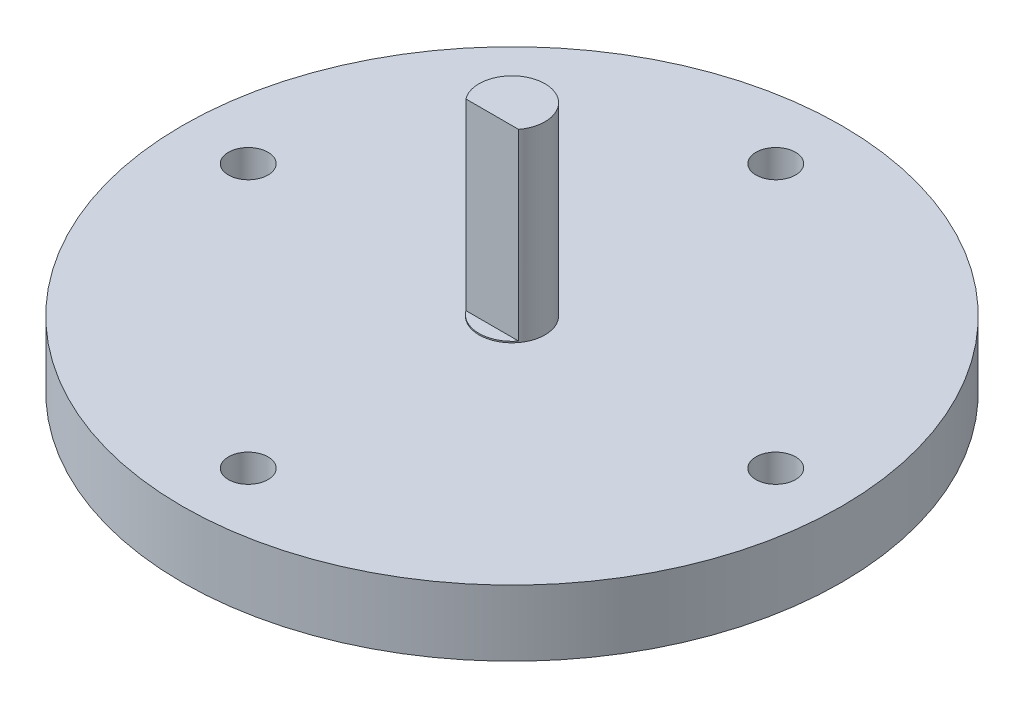
ISO-10303-21;
HEADER;
FILE_DESCRIPTION(('STEP AP214'),'2;1');
FILE_NAME('part.step','',(''),(''),'','','');
FILE_SCHEMA(('AUTOMOTIVE_DESIGN { 1 0 10303 214 1 1 1 1 }'));
ENDSEC;
DATA;
#1=APPLICATION_CONTEXT('core data for automotive mechanical design processes');
#2=APPLICATION_PROTOCOL_DEFINITION('international standard','automotive_design',2000,#1);
#3=PRODUCT_CONTEXT('',#1,'mechanical');
#4=PRODUCT('Part','Part','',(#3));
#5=PRODUCT_RELATED_PRODUCT_CATEGORY('part','',(#4));
#6=PRODUCT_DEFINITION_FORMATION('','',#4);
#7=PRODUCT_DEFINITION_CONTEXT('part definition',#1,'design');
#8=PRODUCT_DEFINITION('design','',#6,#7);
#9=PRODUCT_DEFINITION_SHAPE('','',#8);
#10=(LENGTH_UNIT() NAMED_UNIT(*) SI_UNIT(.MILLI.,.METRE.));
#11=(NAMED_UNIT(*) PLANE_ANGLE_UNIT() SI_UNIT($,.RADIAN.));
#12=(NAMED_UNIT(*) SI_UNIT($,.STERADIAN.) SOLID_ANGLE_UNIT());
#13=UNCERTAINTY_MEASURE_WITH_UNIT(LENGTH_MEASURE(1.E-05),#10,'distance_accuracy_value','');
#14=(GEOMETRIC_REPRESENTATION_CONTEXT(3) GLOBAL_UNCERTAINTY_ASSIGNED_CONTEXT((#13)) GLOBAL_UNIT_ASSIGNED_CONTEXT((#10,
#11,#12)) REPRESENTATION_CONTEXT('',''));
#15=CARTESIAN_POINT('',(0.,0.,0.));
#16=DIRECTION('',(0.,0.,1.));
#17=DIRECTION('',(1.,0.,0.));
#18=AXIS2_PLACEMENT_3D('',#15,#16,#17);
#19=CARTESIAN_POINT('',(0.,5.,0.));
#20=DIRECTION('',(0.,1.,0.));
#21=DIRECTION('',(0.,0.,1.));
#22=AXIS2_PLACEMENT_3D('',#19,#20,#21);
#23=PLANE('',#22);
#24=CARTESIAN_POINT('',(0.,5.,0.));
#25=DIRECTION('',(0.,1.,0.));
#26=DIRECTION('',(0.,0.,1.));
#27=AXIS2_PLACEMENT_3D('',#24,#25,#26);
#28=CIRCLE('',#27,2.5);
#29=CARTESIAN_POINT('',(0.,5.,2.5));
#30=VERTEX_POINT('',#29);
#31=EDGE_CURVE('E75',#30,#30,#28,.T.);
#32=ORIENTED_EDGE('',*,*,#31,.F.);
#33=EDGE_LOOP('',(#32));
#34=FACE_BOUND('',#33,.T.);
#35=CARTESIAN_POINT('',(1.39659253553725E-13,5.,-20.));
#36=DIRECTION('',(0.,1.,0.));
#37=DIRECTION('',(0.,0.,1.));
#38=AXIS2_PLACEMENT_3D('',#35,#36,#37);
#39=CIRCLE('',#38,1.5);
#40=CARTESIAN_POINT('',(1.39659253553725E-13,5.,-18.5));
#41=VERTEX_POINT('',#40);
#42=EDGE_CURVE('E89',#41,#41,#39,.T.);
#43=ORIENTED_EDGE('',*,*,#42,.F.);
#44=EDGE_LOOP('',(#43));
#45=FACE_BOUND('',#44,.T.);
#46=CARTESIAN_POINT('',(0.,5.,20.));
#47=DIRECTION('',(0.,1.,0.));
#48=DIRECTION('',(0.,0.,1.));
#49=AXIS2_PLACEMENT_3D('',#46,#47,#48);
#50=CIRCLE('',#49,1.5);
#51=CARTESIAN_POINT('',(0.,5.,21.5));
#52=VERTEX_POINT('',#51);
#53=EDGE_CURVE('E101',#52,#52,#50,.T.);
#54=ORIENTED_EDGE('',*,*,#53,.F.);
#55=EDGE_LOOP('',(#54));
#56=FACE_BOUND('',#55,.T.);
#57=CARTESIAN_POINT('',(0.,5.,0.));
#58=DIRECTION('',(0.,1.,0.));
#59=DIRECTION('',(0.,0.,1.));
#60=AXIS2_PLACEMENT_3D('',#57,#58,#59);
#61=CIRCLE('',#60,25.);
#62=CARTESIAN_POINT('',(0.,5.,25.));
#63=VERTEX_POINT('',#62);
#64=EDGE_CURVE('E11',#63,#63,#61,.T.);
#65=ORIENTED_EDGE('',*,*,#64,.T.);
#66=EDGE_LOOP('',(#65));
#67=FACE_BOUND('',#66,.T.);
#68=CARTESIAN_POINT('',(-20.,5.,0.));
#69=DIRECTION('',(0.,1.,0.));
#70=DIRECTION('',(0.,0.,1.));
#71=AXIS2_PLACEMENT_3D('',#68,#69,#70);
#72=CIRCLE('',#71,1.5);
#73=CARTESIAN_POINT('',(-20.,5.,1.49999999999993));
#74=VERTEX_POINT('',#73);
#75=EDGE_CURVE('E95',#74,#74,#72,.T.);
#76=ORIENTED_EDGE('',*,*,#75,.F.);
#77=EDGE_LOOP('',(#76));
#78=FACE_BOUND('',#77,.T.);
#79=CARTESIAN_POINT('',(20.,5.,2.09488880330588E-13));
#80=DIRECTION('',(0.,1.,0.));
#81=DIRECTION('',(0.,0.,1.));
#82=AXIS2_PLACEMENT_3D('',#79,#80,#81);
#83=CIRCLE('',#82,1.5);
#84=CARTESIAN_POINT('',(20.,5.,1.50000000000021));
#85=VERTEX_POINT('',#84);
#86=EDGE_CURVE('E78',#85,#85,#83,.T.);
#87=ORIENTED_EDGE('',*,*,#86,.F.);
#88=EDGE_LOOP('',(#87));
#89=FACE_BOUND('',#88,.T.);
#90=ADVANCED_FACE('F33',(#34,#45,#56,#67,#78,#89),#23,.T.);
#91=CARTESIAN_POINT('',(0.,0.,0.));
#92=DIRECTION('',(0.,1.,0.));
#93=DIRECTION('',(0.,0.,1.));
#94=AXIS2_PLACEMENT_3D('',#91,#92,#93);
#95=PLANE('',#94);
#96=CARTESIAN_POINT('',(0.,0.,0.));
#97=DIRECTION('',(0.,-1.,0.));
#98=DIRECTION('',(0.,0.,-1.));
#99=AXIS2_PLACEMENT_3D('',#96,#97,#98);
#100=CIRCLE('',#99,1.5);
#101=CARTESIAN_POINT('',(0.,0.,-1.5));
#102=VERTEX_POINT('',#101);
#103=EDGE_CURVE('E71',#102,#102,#100,.T.);
#104=ORIENTED_EDGE('',*,*,#103,.F.);
#105=EDGE_LOOP('',(#104));
#106=FACE_BOUND('',#105,.T.);
#107=CARTESIAN_POINT('',(0.,0.,0.));
#108=DIRECTION('',(0.,1.,0.));
#109=DIRECTION('',(0.,0.,1.));
#110=AXIS2_PLACEMENT_3D('',#107,#108,#109);
#111=CIRCLE('',#110,25.);
#112=CARTESIAN_POINT('',(0.,0.,25.));
#113=VERTEX_POINT('',#112);
#114=EDGE_CURVE('E37',#113,#113,#111,.T.);
#115=ORIENTED_EDGE('',*,*,#114,.F.);
#116=EDGE_LOOP('',(#115));
#117=FACE_BOUND('',#116,.T.);
#118=CARTESIAN_POINT('',(0.,0.,20.));
#119=DIRECTION('',(0.,1.,0.));
#120=DIRECTION('',(0.,0.,1.));
#121=AXIS2_PLACEMENT_3D('',#118,#119,#120);
#122=CIRCLE('',#121,1.5);
#123=CARTESIAN_POINT('',(0.,0.,21.5));
#124=VERTEX_POINT('',#123);
#125=EDGE_CURVE('E98',#124,#124,#122,.T.);
#126=ORIENTED_EDGE('',*,*,#125,.T.);
#127=EDGE_LOOP('',(#126));
#128=FACE_BOUND('',#127,.T.);
#129=CARTESIAN_POINT('',(-20.,0.,0.));
#130=DIRECTION('',(0.,1.,0.));
#131=DIRECTION('',(0.,0.,1.));
#132=AXIS2_PLACEMENT_3D('',#129,#130,#131);
#133=CIRCLE('',#132,1.5);
#134=CARTESIAN_POINT('',(-20.,0.,1.49999999999993));
#135=VERTEX_POINT('',#134);
#136=EDGE_CURVE('E92',#135,#135,#133,.T.);
#137=ORIENTED_EDGE('',*,*,#136,.T.);
#138=EDGE_LOOP('',(#137));
#139=FACE_BOUND('',#138,.T.);
#140=CARTESIAN_POINT('',(1.39659253553725E-13,0.,-20.));
#141=DIRECTION('',(0.,1.,0.));
#142=DIRECTION('',(0.,0.,1.));
#143=AXIS2_PLACEMENT_3D('',#140,#141,#142);
#144=CIRCLE('',#143,1.5);
#145=CARTESIAN_POINT('',(1.39659253553725E-13,0.,-18.5));
#146=VERTEX_POINT('',#145);
#147=EDGE_CURVE('E87',#146,#146,#144,.T.);
#148=ORIENTED_EDGE('',*,*,#147,.T.);
#149=EDGE_LOOP('',(#148));
#150=FACE_BOUND('',#149,.T.);
#151=CARTESIAN_POINT('',(20.,0.,2.09488880330588E-13));
#152=DIRECTION('',(0.,1.,0.));
#153=DIRECTION('',(0.,0.,1.));
#154=AXIS2_PLACEMENT_3D('',#151,#152,#153);
#155=CIRCLE('',#154,1.5);
#156=CARTESIAN_POINT('',(20.,0.,1.50000000000021));
#157=VERTEX_POINT('',#156);
#158=EDGE_CURVE('E74',#157,#157,#155,.T.);
#159=ORIENTED_EDGE('',*,*,#158,.T.);
#160=EDGE_LOOP('',(#159));
#161=FACE_BOUND('',#160,.T.);
#162=ADVANCED_FACE('F107',(#106,#117,#128,#139,#150,#161),#95,.F.);
#163=CARTESIAN_POINT('',(0.,5.,0.));
#164=DIRECTION('',(0.,-1.,0.));
#165=DIRECTION('',(0.,0.,-1.));
#166=AXIS2_PLACEMENT_3D('',#163,#164,#165);
#167=CYLINDRICAL_SURFACE('',#166,25.);
#168=ORIENTED_EDGE('',*,*,#64,.F.);
#169=EDGE_LOOP('',(#168));
#170=FACE_BOUND('',#169,.T.);
#171=ORIENTED_EDGE('',*,*,#114,.T.);
#172=EDGE_LOOP('',(#171));
#173=FACE_BOUND('',#172,.T.);
#174=ADVANCED_FACE('F35',(#170,#173),#167,.T.);
#175=CARTESIAN_POINT('',(0.,5.,20.));
#176=DIRECTION('',(0.,-1.,0.));
#177=DIRECTION('',(0.,0.,-1.));
#178=AXIS2_PLACEMENT_3D('',#175,#176,#177);
#179=CYLINDRICAL_SURFACE('',#178,1.5);
#180=ORIENTED_EDGE('',*,*,#53,.T.);
#181=EDGE_LOOP('',(#180));
#182=FACE_BOUND('',#181,.T.);
#183=ORIENTED_EDGE('',*,*,#125,.F.);
#184=EDGE_LOOP('',(#183));
#185=FACE_BOUND('',#184,.T.);
#186=ADVANCED_FACE('F110',(#182,#185),#179,.F.);
#187=CARTESIAN_POINT('',(-20.,5.,0.));
#188=DIRECTION('',(0.,-1.,0.));
#189=DIRECTION('',(0.,0.,-1.));
#190=AXIS2_PLACEMENT_3D('',#187,#188,#189);
#191=CYLINDRICAL_SURFACE('',#190,1.5);
#192=ORIENTED_EDGE('',*,*,#75,.T.);
#193=EDGE_LOOP('',(#192));
#194=FACE_BOUND('',#193,.T.);
#195=ORIENTED_EDGE('',*,*,#136,.F.);
#196=EDGE_LOOP('',(#195));
#197=FACE_BOUND('',#196,.T.);
#198=ADVANCED_FACE('F112',(#194,#197),#191,.F.);
#199=CARTESIAN_POINT('',(1.39659253553725E-13,5.,-20.));
#200=DIRECTION('',(0.,-1.,0.));
#201=DIRECTION('',(0.,0.,-1.));
#202=AXIS2_PLACEMENT_3D('',#199,#200,#201);
#203=CYLINDRICAL_SURFACE('',#202,1.5);
#204=ORIENTED_EDGE('',*,*,#42,.T.);
#205=EDGE_LOOP('',(#204));
#206=FACE_BOUND('',#205,.T.);
#207=ORIENTED_EDGE('',*,*,#147,.F.);
#208=EDGE_LOOP('',(#207));
#209=FACE_BOUND('',#208,.T.);
#210=ADVANCED_FACE('F119',(#206,#209),#203,.F.);
#211=CARTESIAN_POINT('',(20.,5.,2.09488880330588E-13));
#212=DIRECTION('',(0.,-1.,0.));
#213=DIRECTION('',(0.,0.,-1.));
#214=AXIS2_PLACEMENT_3D('',#211,#212,#213);
#215=CYLINDRICAL_SURFACE('',#214,1.5);
#216=ORIENTED_EDGE('',*,*,#86,.T.);
#217=EDGE_LOOP('',(#216));
#218=FACE_BOUND('',#217,.T.);
#219=ORIENTED_EDGE('',*,*,#158,.F.);
#220=EDGE_LOOP('',(#219));
#221=FACE_BOUND('',#220,.T.);
#222=ADVANCED_FACE('F142',(#218,#221),#215,.F.);
#223=CARTESIAN_POINT('',(0.,19.,0.));
#224=DIRECTION('',(0.,-1.,0.));
#225=DIRECTION('',(0.,0.,-1.));
#226=AXIS2_PLACEMENT_3D('',#223,#224,#225);
#227=CYLINDRICAL_SURFACE('',#226,2.5);
#228=CARTESIAN_POINT('',(0.,19.,0.));
#229=DIRECTION('',(0.,1.,0.));
#230=DIRECTION('',(0.,0.,1.));
#231=AXIS2_PLACEMENT_3D('',#228,#229,#230);
#232=CIRCLE('',#231,2.5);
#233=CARTESIAN_POINT('',(2.,19.,1.5));
#234=VERTEX_POINT('',#233);
#235=CARTESIAN_POINT('',(-2.,19.,1.5));
#236=VERTEX_POINT('',#235);
#237=EDGE_CURVE('E70',#234,#236,#232,.T.);
#238=ORIENTED_EDGE('',*,*,#237,.F.);
#239=DIRECTION('',(0.,1.,0.));
#240=VECTOR('',#239,1.);
#241=CARTESIAN_POINT('',(2.,5.1,1.5));
#242=LINE('',#241,#240);
#243=CARTESIAN_POINT('',(2.,5.1,1.5));
#244=VERTEX_POINT('',#243);
#245=EDGE_CURVE('E48',#244,#234,#242,.T.);
#246=ORIENTED_EDGE('',*,*,#245,.F.);
#247=CARTESIAN_POINT('',(0.,5.1,0.));
#248=DIRECTION('',(0.,1.,0.));
#249=DIRECTION('',(0.,0.,1.));
#250=AXIS2_PLACEMENT_3D('',#247,#248,#249);
#251=CIRCLE('',#250,2.5);
#252=CARTESIAN_POINT('',(-2.,5.1,1.5));
#253=VERTEX_POINT('',#252);
#254=EDGE_CURVE('E64',#253,#244,#251,.T.);
#255=ORIENTED_EDGE('',*,*,#254,.F.);
#256=DIRECTION('',(0.,1.,0.));
#257=VECTOR('',#256,1.);
#258=CARTESIAN_POINT('',(-2.,5.1,1.5));
#259=LINE('',#258,#257);
#260=EDGE_CURVE('E54',#253,#236,#259,.T.);
#261=ORIENTED_EDGE('',*,*,#260,.T.);
#262=EDGE_LOOP('',(#238,#246,#255,#261));
#263=FACE_BOUND('',#262,.T.);
#264=ORIENTED_EDGE('',*,*,#31,.T.);
#265=EDGE_LOOP('',(#264));
#266=FACE_BOUND('',#265,.T.);
#267=ADVANCED_FACE('F68',(#263,#266),#227,.T.);
#268=CARTESIAN_POINT('',(0.,19.,0.));
#269=DIRECTION('',(0.,1.,0.));
#270=DIRECTION('',(0.,0.,1.));
#271=AXIS2_PLACEMENT_3D('',#268,#269,#270);
#272=PLANE('',#271);
#273=DIRECTION('',(-1.,0.,0.));
#274=VECTOR('',#273,1.);
#275=CARTESIAN_POINT('',(2.,19.,1.5));
#276=LINE('',#275,#274);
#277=EDGE_CURVE('E59',#234,#236,#276,.T.);
#278=ORIENTED_EDGE('',*,*,#277,.F.);
#279=ORIENTED_EDGE('',*,*,#237,.T.);
#280=EDGE_LOOP('',(#278,#279));
#281=FACE_BOUND('',#280,.T.);
#282=ADVANCED_FACE('F73',(#281),#272,.T.);
#283=CARTESIAN_POINT('',(0.,5.,0.));
#284=DIRECTION('',(0.,-1.,0.));
#285=DIRECTION('',(0.,0.,-1.));
#286=AXIS2_PLACEMENT_3D('',#283,#284,#285);
#287=CYLINDRICAL_SURFACE('',#286,1.5);
#288=CARTESIAN_POINT('',(0.,5.,0.));
#289=DIRECTION('',(0.,-1.,0.));
#290=DIRECTION('',(0.,0.,-1.));
#291=AXIS2_PLACEMENT_3D('',#288,#289,#290);
#292=CIRCLE('',#291,1.5);
#293=CARTESIAN_POINT('',(0.,5.,-1.5));
#294=VERTEX_POINT('',#293);
#295=EDGE_CURVE('E81',#294,#294,#292,.T.);
#296=ORIENTED_EDGE('',*,*,#295,.F.);
#297=EDGE_LOOP('',(#296));
#298=FACE_BOUND('',#297,.T.);
#299=ORIENTED_EDGE('',*,*,#103,.T.);
#300=EDGE_LOOP('',(#299));
#301=FACE_BOUND('',#300,.T.);
#302=ADVANCED_FACE('F159',(#298,#301),#287,.F.);
#303=CARTESIAN_POINT('',(0.,5.,0.));
#304=DIRECTION('',(0.,-1.,0.));
#305=DIRECTION('',(0.,0.,-1.));
#306=AXIS2_PLACEMENT_3D('',#303,#304,#305);
#307=PLANE('',#306);
#308=ORIENTED_EDGE('',*,*,#295,.T.);
#309=EDGE_LOOP('',(#308));
#310=FACE_BOUND('',#309,.T.);
#311=ADVANCED_FACE('F162',(#310),#307,.T.);
#312=CARTESIAN_POINT('',(2.,5.1,1.5));
#313=DIRECTION('',(0.,0.,-1.));
#314=DIRECTION('',(-1.,0.,0.));
#315=AXIS2_PLACEMENT_3D('',#312,#313,#314);
#316=PLANE('',#315);
#317=ORIENTED_EDGE('',*,*,#277,.T.);
#318=ORIENTED_EDGE('',*,*,#260,.F.);
#319=DIRECTION('',(-1.,0.,0.));
#320=VECTOR('',#319,1.);
#321=CARTESIAN_POINT('',(2.,5.1,1.5));
#322=LINE('',#321,#320);
#323=EDGE_CURVE('E174',#244,#253,#322,.T.);
#324=ORIENTED_EDGE('',*,*,#323,.F.);
#325=ORIENTED_EDGE('',*,*,#245,.T.);
#326=EDGE_LOOP('',(#317,#318,#324,#325));
#327=FACE_BOUND('',#326,.T.);
#328=ADVANCED_FACE('F60',(#327),#316,.F.);
#329=CARTESIAN_POINT('',(0.,5.1,0.));
#330=DIRECTION('',(0.,1.,0.));
#331=DIRECTION('',(0.,0.,1.));
#332=AXIS2_PLACEMENT_3D('',#329,#330,#331);
#333=PLANE('',#332);
#334=ORIENTED_EDGE('',*,*,#254,.T.);
#335=ORIENTED_EDGE('',*,*,#323,.T.);
#336=EDGE_LOOP('',(#334,#335));
#337=FACE_BOUND('',#336,.T.);
#338=ADVANCED_FACE('F169',(#337),#333,.T.);
#339=CLOSED_SHELL('',(#90,#162,#174,#186,#198,#210,#222,#267,#282,#302,#311,#328,#338));
#340=MANIFOLD_SOLID_BREP('B2',#339);
#341=ADVANCED_BREP_SHAPE_REPRESENTATION('',(#18,#340),#14);
#342=SHAPE_DEFINITION_REPRESENTATION(#9,#341);
ENDSEC;
END-ISO-10303-21;
